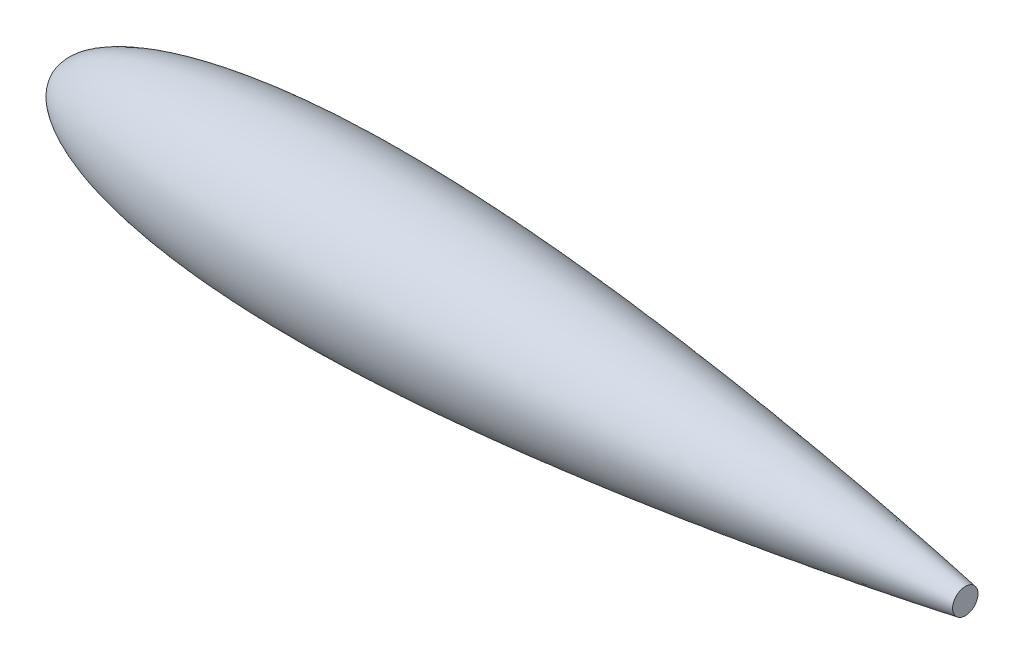
ISO-10303-21;
HEADER;
FILE_DESCRIPTION(('STEP AP214'),'2;1');
FILE_NAME('part.step','',(''),(''),'','','');
FILE_SCHEMA(('AUTOMOTIVE_DESIGN { 1 0 10303 214 1 1 1 1 }'));
ENDSEC;
DATA;
#1=APPLICATION_CONTEXT('core data for automotive mechanical design processes');
#2=APPLICATION_PROTOCOL_DEFINITION('international standard','automotive_design',2000,#1);
#3=PRODUCT_CONTEXT('',#1,'mechanical');
#4=PRODUCT('Part','Part','',(#3));
#5=PRODUCT_RELATED_PRODUCT_CATEGORY('part','',(#4));
#6=PRODUCT_DEFINITION_FORMATION('','',#4);
#7=PRODUCT_DEFINITION_CONTEXT('part definition',#1,'design');
#8=PRODUCT_DEFINITION('design','',#6,#7);
#9=PRODUCT_DEFINITION_SHAPE('','',#8);
#10=(LENGTH_UNIT() NAMED_UNIT(*) SI_UNIT(.MILLI.,.METRE.));
#11=(NAMED_UNIT(*) PLANE_ANGLE_UNIT() SI_UNIT($,.RADIAN.));
#12=(NAMED_UNIT(*) SI_UNIT($,.STERADIAN.) SOLID_ANGLE_UNIT());
#13=UNCERTAINTY_MEASURE_WITH_UNIT(LENGTH_MEASURE(1.E-05),#10,'distance_accuracy_value','');
#14=(GEOMETRIC_REPRESENTATION_CONTEXT(3) GLOBAL_UNCERTAINTY_ASSIGNED_CONTEXT((#13)) GLOBAL_UNIT_ASSIGNED_CONTEXT((#10,
#11,#12)) REPRESENTATION_CONTEXT('',''));
#15=CARTESIAN_POINT('',(0.,0.,0.));
#16=DIRECTION('',(0.,0.,1.));
#17=DIRECTION('',(1.,0.,0.));
#18=AXIS2_PLACEMENT_3D('',#15,#16,#17);
#19=CARTESIAN_POINT('',(700.000000000287,-5.45059533475018E-11,0.));
#20=CARTESIAN_POINT('',(698.491610118353,0.287105852651462,0.));
#21=CARTESIAN_POINT('',(695.548172643482,0.844768016576524,0.));
#22=CARTESIAN_POINT('',(689.533934487261,1.97793370968544,0.));
#23=CARTESIAN_POINT('',(683.719860130819,3.05403113798536,0.));
#24=CARTESIAN_POINT('',(676.594743299771,4.36483352244055,0.));
#25=CARTESIAN_POINT('',(670.238919000259,5.51463152499707,0.));
#26=CARTESIAN_POINT('',(663.430739750832,6.73620172122904,0.));
#27=CARTESIAN_POINT('',(656.870951288914,7.89640209815918,0.));
#28=CARTESIAN_POINT('',(648.514486610849,9.35915302100259,0.));
#29=CARTESIAN_POINT('',(638.564267484055,11.0723936179982,0.));
#30=CARTESIAN_POINT('',(626.899067529967,13.0430213095217,0.));
#31=CARTESIAN_POINT('',(613.589671532404,15.2389684559675,0.));
#32=CARTESIAN_POINT('',(600.255716726952,17.388859228469,0.));
#33=CARTESIAN_POINT('',(586.923625352405,19.4886881545797,0.));
#34=CARTESIAN_POINT('',(573.578572291143,21.5420996708373,0.));
#35=CARTESIAN_POINT('',(560.229511216799,23.5479894597663,0.));
#36=CARTESIAN_POINT('',(543.532608643282,25.9975061433719,0.));
#37=CARTESIAN_POINT('',(523.483904055627,28.8438260362012,0.));
#38=CARTESIAN_POINT('',(500.07413667783,32.0288099962595,0.));
#39=CARTESIAN_POINT('',(473.295240638746,35.4779343822419,0.));
#40=CARTESIAN_POINT('',(446.491196853937,38.7280022544341,0.));
#41=CARTESIAN_POINT('',(419.662431958949,41.7662321415238,0.));
#42=CARTESIAN_POINT('',(392.808561014916,44.5756094743261,0.));
#43=CARTESIAN_POINT('',(365.929618681771,47.1336094387162,0.));
#44=CARTESIAN_POINT('',(332.299295573408,49.98252937333,0.));
#45=CARTESIAN_POINT('',(291.893431334132,52.7739299955736,0.));
#46=CARTESIAN_POINT('',(244.684921450845,54.9356954275126,0.));
#47=CARTESIAN_POINT('',(197.42297850035,55.3565586641933,0.));
#48=CARTESIAN_POINT('',(156.930625872123,54.0129056239504,0.));
#49=CARTESIAN_POINT('',(121.249691162599,51.2071859261408,0.));
#50=CARTESIAN_POINT('',(92.546102756152,47.5868195105461,0.));
#51=CARTESIAN_POINT('',(66.5075233874181,42.6258704142679,0.));
#52=CARTESIAN_POINT('',(44.5378435874919,36.4382308237499,0.));
#53=CARTESIAN_POINT('',(29.4704990905846,30.5574703942182,0.));
#54=CARTESIAN_POINT('',(19.6355752613588,25.4965726593439,0.));
#55=CARTESIAN_POINT('',(13.0626249199965,21.1371607063526,0.));
#56=CARTESIAN_POINT('',(8.67692723716966,17.4485272648449,0.));
#57=CARTESIAN_POINT('',(5.69016405118924,14.2867600197887,0.));
#58=CARTESIAN_POINT('',(3.61055970511878,11.5018802296931,0.));
#59=CARTESIAN_POINT('',(2.13850234811168,8.95956261669089,0.));
#60=CARTESIAN_POINT('',(1.12371816686566,6.60427672891208,0.));
#61=CARTESIAN_POINT('',(0.37671502878073,4.0981810653392,0.));
#62=CARTESIAN_POINT('',(0.0768092003510136,2.15941421147303,0.));
#63=CARTESIAN_POINT('',(-0.000260822085208529,0.812598679081965,0.));
#64=CARTESIAN_POINT('',(0.,0.,0.));
#65=B_SPLINE_CURVE_WITH_KNOTS('',4,(#19,#20,#21,#22,#23,#24,#25,#26,#27,#28,#29,#30,#31,#32,#33,
#34,#35,#36,#37,#38,#39,#40,#41,#42,#43,#44,#45,#46,#47,#48,#49,#50,#51,#52,#53,#54,#55,#56,#57,
#58,#59,#60,#61,#62,#63,#64),.UNSPECIFIED.,.F.,.F.,(5,1,1,1,1,1,1,1,1,1,1,1,1,1,1,1,1,1,1,1,1,1,
1,1,1,1,1,1,1,1,1,1,1,1,1,1,1,1,1,1,1,1,5),(0.,0.0085124245466125,0.017024849093225,
0.0255372736398375,0.03404969818645,0.0425621227330625,0.051074547279675,0.0595869718262875,
0.0680993963729,0.0851242447186316,0.102149093064363,0.119173941410095,0.136198789755827,
0.153223638685373,0.170248487614919,0.187273336544465,0.204298185474011,0.238347883135868,
0.272397580797725,0.306447277442708,0.340496974087692,0.37454667140154,0.408596368715389,
0.442646066384275,0.476695764053162,0.544795158126485,0.612894550986596,0.680993942402503,
0.715043632483731,0.749093322564958,0.793393394366875,0.826865415151555,0.84861168417468,
0.864064157985737,0.87485300815042,0.882555584133747,0.888316148487624,0.89291099922187,
0.896746281008525,0.900049593453942,0.9031018878708,0.905818233367635,0.90990800417829),.UNSPECIFIED.);
#66=CARTESIAN_POINT('',(0.,0.,0.));
#67=DIRECTION('',(-1.,0.,0.));
#68=AXIS1_PLACEMENT('',#66,#67);
#69=SURFACE_OF_REVOLUTION('',#65,#68);
#70=CARTESIAN_POINT('',(0.,0.,0.));
#71=VERTEX_POINT('',#70);
#72=VERTEX_LOOP('',#71);
#73=FACE_BOUND('',#72,.T.);
#74=CARTESIAN_POINT('',(650.,-2.52856623907857E-11,0.));
#75=DIRECTION('',(-1.,0.,0.));
#76=DIRECTION('',(0.,-1.,0.));
#77=AXIS2_PLACEMENT_3D('',#74,#75,#76);
#78=CIRCLE('',#77,9.09594965490134);
#79=CARTESIAN_POINT('',(649.999999999999,-9.09594965492663,0.));
#80=VERTEX_POINT('',#79);
#81=EDGE_CURVE('E11',#80,#80,#78,.F.);
#82=ORIENTED_EDGE('',*,*,#81,.F.);
#83=EDGE_LOOP('',(#82));
#84=FACE_BOUND('',#83,.T.);
#85=ADVANCED_FACE('F41',(#73,#84),#69,.T.);
#86=CARTESIAN_POINT('',(650.,0.,0.));
#87=DIRECTION('',(1.,0.,0.));
#88=DIRECTION('',(0.,0.,-1.));
#89=AXIS2_PLACEMENT_3D('',#86,#87,#88);
#90=PLANE('',#89);
#91=ORIENTED_EDGE('',*,*,#81,.T.);
#92=EDGE_LOOP('',(#91));
#93=FACE_BOUND('',#92,.T.);
#94=ADVANCED_FACE('F51',(#93),#90,.T.);
#95=CLOSED_SHELL('',(#85,#94));
#96=MANIFOLD_SOLID_BREP('B2',#95);
#97=ADVANCED_BREP_SHAPE_REPRESENTATION('',(#18,#96),#14);
#98=SHAPE_DEFINITION_REPRESENTATION(#9,#97);
ENDSEC;
END-ISO-10303-21;
